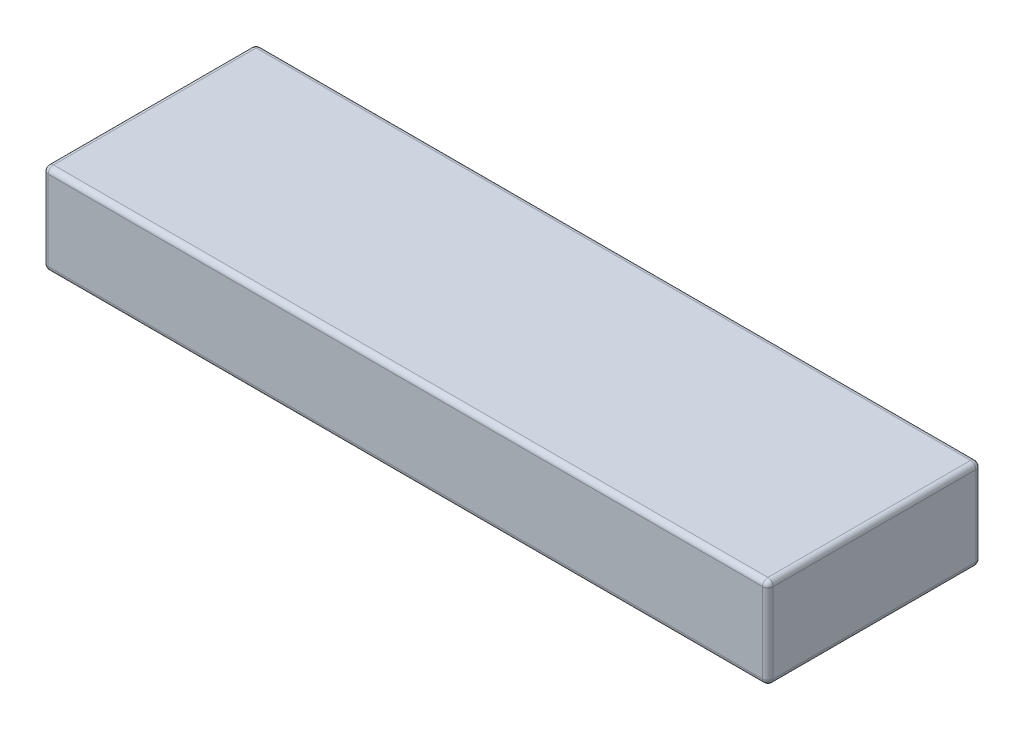
ISO-10303-21;
HEADER;
FILE_DESCRIPTION(('STEP AP214'),'2;1');
FILE_NAME('part.step','',(''),(''),'','','');
FILE_SCHEMA(('AUTOMOTIVE_DESIGN { 1 0 10303 214 1 1 1 1 }'));
ENDSEC;
DATA;
#1=APPLICATION_CONTEXT('core data for automotive mechanical design processes');
#2=APPLICATION_PROTOCOL_DEFINITION('international standard','automotive_design',2000,#1);
#3=PRODUCT_CONTEXT('',#1,'mechanical');
#4=PRODUCT('Part','Part','',(#3));
#5=PRODUCT_RELATED_PRODUCT_CATEGORY('part','',(#4));
#6=PRODUCT_DEFINITION_FORMATION('','',#4);
#7=PRODUCT_DEFINITION_CONTEXT('part definition',#1,'design');
#8=PRODUCT_DEFINITION('design','',#6,#7);
#9=PRODUCT_DEFINITION_SHAPE('','',#8);
#10=(LENGTH_UNIT() NAMED_UNIT(*) SI_UNIT(.MILLI.,.METRE.));
#11=(NAMED_UNIT(*) PLANE_ANGLE_UNIT() SI_UNIT($,.RADIAN.));
#12=(NAMED_UNIT(*) SI_UNIT($,.STERADIAN.) SOLID_ANGLE_UNIT());
#13=UNCERTAINTY_MEASURE_WITH_UNIT(LENGTH_MEASURE(1.E-05),#10,'distance_accuracy_value','');
#14=(GEOMETRIC_REPRESENTATION_CONTEXT(3) GLOBAL_UNCERTAINTY_ASSIGNED_CONTEXT((#13)) GLOBAL_UNIT_ASSIGNED_CONTEXT((#10,
#11,#12)) REPRESENTATION_CONTEXT('',''));
#15=CARTESIAN_POINT('',(0.,0.,0.));
#16=DIRECTION('',(0.,0.,1.));
#17=DIRECTION('',(1.,0.,0.));
#18=AXIS2_PLACEMENT_3D('',#15,#16,#17);
#19=CARTESIAN_POINT('',(68.,17.,20.));
#20=DIRECTION('',(-1.,0.,0.));
#21=DIRECTION('',(0.,0.,1.));
#22=AXIS2_PLACEMENT_3D('',#19,#20,#21);
#23=PLANE('',#22);
#24=DIRECTION('',(0.,0.,-1.));
#25=VECTOR('',#24,1.);
#26=CARTESIAN_POINT('',(68.,16.,20.));
#27=LINE('',#26,#25);
#28=CARTESIAN_POINT('',(68.,16.,-19.));
#29=VERTEX_POINT('',#28);
#30=CARTESIAN_POINT('',(68.,16.,19.));
#31=VERTEX_POINT('',#30);
#32=EDGE_CURVE('E223',#29,#31,#27,.F.);
#33=ORIENTED_EDGE('',*,*,#32,.T.);
#34=DIRECTION('',(0.,-1.,0.));
#35=VECTOR('',#34,1.);
#36=CARTESIAN_POINT('',(68.,17.,19.));
#37=LINE('',#36,#35);
#38=CARTESIAN_POINT('',(68.,1.,19.));
#39=VERTEX_POINT('',#38);
#40=EDGE_CURVE('E230',#31,#39,#37,.T.);
#41=ORIENTED_EDGE('',*,*,#40,.T.);
#42=DIRECTION('',(0.,0.,-1.));
#43=VECTOR('',#42,1.);
#44=CARTESIAN_POINT('',(68.,1.,-20.));
#45=LINE('',#44,#43);
#46=CARTESIAN_POINT('',(68.,1.,-19.));
#47=VERTEX_POINT('',#46);
#48=EDGE_CURVE('E226',#39,#47,#45,.T.);
#49=ORIENTED_EDGE('',*,*,#48,.T.);
#50=DIRECTION('',(0.,-1.,0.));
#51=VECTOR('',#50,1.);
#52=CARTESIAN_POINT('',(68.,17.,-19.));
#53=LINE('',#52,#51);
#54=EDGE_CURVE('E220',#47,#29,#53,.F.);
#55=ORIENTED_EDGE('',*,*,#54,.T.);
#56=EDGE_LOOP('',(#33,#41,#49,#55));
#57=FACE_BOUND('',#56,.T.);
#58=ADVANCED_FACE('F45',(#57),#23,.F.);
#59=CARTESIAN_POINT('',(-68.,17.,-20.));
#60=DIRECTION('',(0.,0.,1.));
#61=DIRECTION('',(1.,0.,0.));
#62=AXIS2_PLACEMENT_3D('',#59,#60,#61);
#63=PLANE('',#62);
#64=DIRECTION('',(-1.,0.,0.));
#65=VECTOR('',#64,1.);
#66=CARTESIAN_POINT('',(-68.,1.,-20.));
#67=LINE('',#66,#65);
#68=CARTESIAN_POINT('',(67.,1.,-20.));
#69=VERTEX_POINT('',#68);
#70=CARTESIAN_POINT('',(-67.,1.,-20.));
#71=VERTEX_POINT('',#70);
#72=EDGE_CURVE('E146',#69,#71,#67,.T.);
#73=ORIENTED_EDGE('',*,*,#72,.T.);
#74=DIRECTION('',(0.,-1.,0.));
#75=VECTOR('',#74,1.);
#76=CARTESIAN_POINT('',(-67.,17.,-20.));
#77=LINE('',#76,#75);
#78=CARTESIAN_POINT('',(-67.,16.,-20.));
#79=VERTEX_POINT('',#78);
#80=EDGE_CURVE('E141',#71,#79,#77,.F.);
#81=ORIENTED_EDGE('',*,*,#80,.T.);
#82=DIRECTION('',(-1.,0.,0.));
#83=VECTOR('',#82,1.);
#84=CARTESIAN_POINT('',(-68.,16.,-20.));
#85=LINE('',#84,#83);
#86=CARTESIAN_POINT('',(67.,16.,-20.));
#87=VERTEX_POINT('',#86);
#88=EDGE_CURVE('E133',#79,#87,#85,.F.);
#89=ORIENTED_EDGE('',*,*,#88,.T.);
#90=DIRECTION('',(0.,-1.,0.));
#91=VECTOR('',#90,1.);
#92=CARTESIAN_POINT('',(67.,17.,-20.));
#93=LINE('',#92,#91);
#94=EDGE_CURVE('E138',#87,#69,#93,.T.);
#95=ORIENTED_EDGE('',*,*,#94,.T.);
#96=EDGE_LOOP('',(#73,#81,#89,#95));
#97=FACE_BOUND('',#96,.T.);
#98=ADVANCED_FACE('F136',(#97),#63,.F.);
#99=CARTESIAN_POINT('',(-68.,17.,20.));
#100=DIRECTION('',(1.,0.,0.));
#101=DIRECTION('',(0.,0.,-1.));
#102=AXIS2_PLACEMENT_3D('',#99,#100,#101);
#103=PLANE('',#102);
#104=DIRECTION('',(0.,0.,1.));
#105=VECTOR('',#104,1.);
#106=CARTESIAN_POINT('',(-68.,16.,20.));
#107=LINE('',#106,#105);
#108=CARTESIAN_POINT('',(-68.,16.,19.));
#109=VERTEX_POINT('',#108);
#110=CARTESIAN_POINT('',(-68.,16.,-19.));
#111=VERTEX_POINT('',#110);
#112=EDGE_CURVE('E197',#109,#111,#107,.F.);
#113=ORIENTED_EDGE('',*,*,#112,.T.);
#114=DIRECTION('',(0.,-1.,0.));
#115=VECTOR('',#114,1.);
#116=CARTESIAN_POINT('',(-68.,17.,-19.));
#117=LINE('',#116,#115);
#118=CARTESIAN_POINT('',(-68.,1.,-19.));
#119=VERTEX_POINT('',#118);
#120=EDGE_CURVE('E204',#111,#119,#117,.T.);
#121=ORIENTED_EDGE('',*,*,#120,.T.);
#122=DIRECTION('',(0.,0.,1.));
#123=VECTOR('',#122,1.);
#124=CARTESIAN_POINT('',(-68.,1.,20.));
#125=LINE('',#124,#123);
#126=CARTESIAN_POINT('',(-68.,1.,19.));
#127=VERTEX_POINT('',#126);
#128=EDGE_CURVE('E200',#119,#127,#125,.T.);
#129=ORIENTED_EDGE('',*,*,#128,.T.);
#130=DIRECTION('',(0.,-1.,0.));
#131=VECTOR('',#130,1.);
#132=CARTESIAN_POINT('',(-68.,17.,19.));
#133=LINE('',#132,#131);
#134=EDGE_CURVE('E194',#127,#109,#133,.F.);
#135=ORIENTED_EDGE('',*,*,#134,.T.);
#136=EDGE_LOOP('',(#113,#121,#129,#135));
#137=FACE_BOUND('',#136,.T.);
#138=ADVANCED_FACE('F323',(#137),#103,.F.);
#139=CARTESIAN_POINT('',(-68.,17.,20.));
#140=DIRECTION('',(0.,0.,-1.));
#141=DIRECTION('',(-1.,0.,0.));
#142=AXIS2_PLACEMENT_3D('',#139,#140,#141);
#143=PLANE('',#142);
#144=DIRECTION('',(1.,0.,0.));
#145=VECTOR('',#144,1.);
#146=CARTESIAN_POINT('',(68.,1.,20.));
#147=LINE('',#146,#145);
#148=CARTESIAN_POINT('',(-67.,1.,20.));
#149=VERTEX_POINT('',#148);
#150=CARTESIAN_POINT('',(67.,1.,20.));
#151=VERTEX_POINT('',#150);
#152=EDGE_CURVE('E213',#149,#151,#147,.T.);
#153=ORIENTED_EDGE('',*,*,#152,.T.);
#154=DIRECTION('',(0.,-1.,0.));
#155=VECTOR('',#154,1.);
#156=CARTESIAN_POINT('',(67.,17.,20.));
#157=LINE('',#156,#155);
#158=CARTESIAN_POINT('',(67.,16.,20.));
#159=VERTEX_POINT('',#158);
#160=EDGE_CURVE('E217',#151,#159,#157,.F.);
#161=ORIENTED_EDGE('',*,*,#160,.T.);
#162=DIRECTION('',(1.,0.,0.));
#163=VECTOR('',#162,1.);
#164=CARTESIAN_POINT('',(-68.,16.,20.));
#165=LINE('',#164,#163);
#166=CARTESIAN_POINT('',(-67.,16.,20.));
#167=VERTEX_POINT('',#166);
#168=EDGE_CURVE('E210',#159,#167,#165,.F.);
#169=ORIENTED_EDGE('',*,*,#168,.T.);
#170=DIRECTION('',(0.,-1.,0.));
#171=VECTOR('',#170,1.);
#172=CARTESIAN_POINT('',(-67.,17.,20.));
#173=LINE('',#172,#171);
#174=EDGE_CURVE('E207',#167,#149,#173,.T.);
#175=ORIENTED_EDGE('',*,*,#174,.T.);
#176=EDGE_LOOP('',(#153,#161,#169,#175));
#177=FACE_BOUND('',#176,.T.);
#178=ADVANCED_FACE('F332',(#177),#143,.F.);
#179=CARTESIAN_POINT('',(0.,17.,0.));
#180=DIRECTION('',(0.,-1.,0.));
#181=DIRECTION('',(0.,0.,-1.));
#182=AXIS2_PLACEMENT_3D('',#179,#180,#181);
#183=PLANE('',#182);
#184=DIRECTION('',(0.,0.,1.));
#185=VECTOR('',#184,1.);
#186=CARTESIAN_POINT('',(-67.,17.,0.));
#187=LINE('',#186,#185);
#188=CARTESIAN_POINT('',(-67.,17.,-19.));
#189=VERTEX_POINT('',#188);
#190=CARTESIAN_POINT('',(-67.,17.,19.));
#191=VERTEX_POINT('',#190);
#192=EDGE_CURVE('E55',#189,#191,#187,.T.);
#193=ORIENTED_EDGE('',*,*,#192,.T.);
#194=DIRECTION('',(1.,0.,0.));
#195=VECTOR('',#194,1.);
#196=CARTESIAN_POINT('',(0.,17.,19.));
#197=LINE('',#196,#195);
#198=CARTESIAN_POINT('',(67.,17.,19.));
#199=VERTEX_POINT('',#198);
#200=EDGE_CURVE('E11',#191,#199,#197,.T.);
#201=ORIENTED_EDGE('',*,*,#200,.T.);
#202=DIRECTION('',(0.,0.,-1.));
#203=VECTOR('',#202,1.);
#204=CARTESIAN_POINT('',(67.,17.,0.));
#205=LINE('',#204,#203);
#206=CARTESIAN_POINT('',(67.,17.,-19.));
#207=VERTEX_POINT('',#206);
#208=EDGE_CURVE('E233',#199,#207,#205,.T.);
#209=ORIENTED_EDGE('',*,*,#208,.T.);
#210=DIRECTION('',(-1.,0.,0.));
#211=VECTOR('',#210,1.);
#212=CARTESIAN_POINT('',(0.,17.,-19.));
#213=LINE('',#212,#211);
#214=EDGE_CURVE('E66',#207,#189,#213,.T.);
#215=ORIENTED_EDGE('',*,*,#214,.T.);
#216=EDGE_LOOP('',(#193,#201,#209,#215));
#217=FACE_BOUND('',#216,.T.);
#218=ADVANCED_FACE('F354',(#217),#183,.F.);
#219=CARTESIAN_POINT('',(0.,0.,0.));
#220=DIRECTION('',(0.,-1.,0.));
#221=DIRECTION('',(0.,0.,-1.));
#222=AXIS2_PLACEMENT_3D('',#219,#220,#221);
#223=PLANE('',#222);
#224=DIRECTION('',(0.,0.,1.));
#225=VECTOR('',#224,1.);
#226=CARTESIAN_POINT('',(-67.,0.,-20.));
#227=LINE('',#226,#225);
#228=CARTESIAN_POINT('',(-67.,0.,19.));
#229=VERTEX_POINT('',#228);
#230=CARTESIAN_POINT('',(-67.,0.,-19.));
#231=VERTEX_POINT('',#230);
#232=EDGE_CURVE('E187',#229,#231,#227,.F.);
#233=ORIENTED_EDGE('',*,*,#232,.T.);
#234=DIRECTION('',(-1.,0.,0.));
#235=VECTOR('',#234,1.);
#236=CARTESIAN_POINT('',(68.,0.,-19.));
#237=LINE('',#236,#235);
#238=CARTESIAN_POINT('',(67.,0.,-19.));
#239=VERTEX_POINT('',#238);
#240=EDGE_CURVE('E190',#231,#239,#237,.F.);
#241=ORIENTED_EDGE('',*,*,#240,.T.);
#242=DIRECTION('',(0.,0.,-1.));
#243=VECTOR('',#242,1.);
#244=CARTESIAN_POINT('',(67.,0.,20.));
#245=LINE('',#244,#243);
#246=CARTESIAN_POINT('',(67.,0.,19.));
#247=VERTEX_POINT('',#246);
#248=EDGE_CURVE('E181',#239,#247,#245,.F.);
#249=ORIENTED_EDGE('',*,*,#248,.T.);
#250=DIRECTION('',(1.,0.,0.));
#251=VECTOR('',#250,1.);
#252=CARTESIAN_POINT('',(-68.,0.,19.));
#253=LINE('',#252,#251);
#254=EDGE_CURVE('E184',#247,#229,#253,.F.);
#255=ORIENTED_EDGE('',*,*,#254,.T.);
#256=EDGE_LOOP('',(#233,#241,#249,#255));
#257=FACE_BOUND('',#256,.T.);
#258=ADVANCED_FACE('F356',(#257),#223,.T.);
#259=CARTESIAN_POINT('',(0.,16.,19.));
#260=DIRECTION('',(1.,0.,0.));
#261=DIRECTION('',(0.,0.,-1.));
#262=AXIS2_PLACEMENT_3D('',#259,#260,#261);
#263=CYLINDRICAL_SURFACE('',#262,1.);
#264=CARTESIAN_POINT('',(67.,16.,19.));
#265=DIRECTION('',(1.,0.,0.));
#266=DIRECTION('',(0.,0.,-1.));
#267=AXIS2_PLACEMENT_3D('',#264,#265,#266);
#268=CIRCLE('',#267,1.);
#269=EDGE_CURVE('E49',#199,#159,#268,.T.);
#270=ORIENTED_EDGE('',*,*,#269,.F.);
#271=ORIENTED_EDGE('',*,*,#200,.F.);
#272=CARTESIAN_POINT('',(-67.,16.,19.));
#273=DIRECTION('',(-1.,0.,0.));
#274=DIRECTION('',(0.,0.,1.));
#275=AXIS2_PLACEMENT_3D('',#272,#273,#274);
#276=CIRCLE('',#275,1.);
#277=EDGE_CURVE('E175',#167,#191,#276,.T.);
#278=ORIENTED_EDGE('',*,*,#277,.F.);
#279=ORIENTED_EDGE('',*,*,#168,.F.);
#280=EDGE_LOOP('',(#270,#271,#278,#279));
#281=FACE_BOUND('',#280,.T.);
#282=ADVANCED_FACE('F47',(#281),#263,.T.);
#283=CARTESIAN_POINT('',(67.,16.,19.));
#284=DIRECTION('',(0.,0.,1.));
#285=DIRECTION('',(1.,0.,0.));
#286=AXIS2_PLACEMENT_3D('',#283,#284,#285);
#287=SPHERICAL_SURFACE('',#286,1.);
#288=CARTESIAN_POINT('',(67.,16.,19.));
#289=DIRECTION('',(0.,0.,1.));
#290=DIRECTION('',(1.,0.,0.));
#291=AXIS2_PLACEMENT_3D('',#288,#289,#290);
#292=CIRCLE('',#291,1.);
#293=EDGE_CURVE('E300',#199,#31,#292,.F.);
#294=ORIENTED_EDGE('',*,*,#293,.F.);
#295=ORIENTED_EDGE('',*,*,#269,.T.);
#296=CARTESIAN_POINT('',(67.,16.,19.));
#297=DIRECTION('',(0.,1.,0.));
#298=DIRECTION('',(0.,0.,1.));
#299=AXIS2_PLACEMENT_3D('',#296,#297,#298);
#300=CIRCLE('',#299,1.);
#301=EDGE_CURVE('E304',#31,#159,#300,.F.);
#302=ORIENTED_EDGE('',*,*,#301,.F.);
#303=EDGE_LOOP('',(#294,#295,#302));
#304=FACE_BOUND('',#303,.T.);
#305=ADVANCED_FACE('F350',(#304),#287,.T.);
#306=CARTESIAN_POINT('',(-67.,16.,19.));
#307=DIRECTION('',(0.,1.,0.));
#308=DIRECTION('',(0.,0.,1.));
#309=AXIS2_PLACEMENT_3D('',#306,#307,#308);
#310=SPHERICAL_SURFACE('',#309,1.);
#311=CARTESIAN_POINT('',(-67.,16.,19.));
#312=DIRECTION('',(0.,1.,0.));
#313=DIRECTION('',(0.,0.,1.));
#314=AXIS2_PLACEMENT_3D('',#311,#312,#313);
#315=CIRCLE('',#314,1.);
#316=EDGE_CURVE('E292',#167,#109,#315,.F.);
#317=ORIENTED_EDGE('',*,*,#316,.F.);
#318=ORIENTED_EDGE('',*,*,#277,.T.);
#319=CARTESIAN_POINT('',(-67.,16.,19.));
#320=DIRECTION('',(0.,0.,1.));
#321=DIRECTION('',(1.,0.,0.));
#322=AXIS2_PLACEMENT_3D('',#319,#320,#321);
#323=CIRCLE('',#322,1.);
#324=EDGE_CURVE('E296',#109,#191,#323,.F.);
#325=ORIENTED_EDGE('',*,*,#324,.F.);
#326=EDGE_LOOP('',(#317,#318,#325));
#327=FACE_BOUND('',#326,.T.);
#328=ADVANCED_FACE('F313',(#327),#310,.T.);
#329=CARTESIAN_POINT('',(67.,17.,19.));
#330=DIRECTION('',(0.,-1.,0.));
#331=DIRECTION('',(0.,0.,-1.));
#332=AXIS2_PLACEMENT_3D('',#329,#330,#331);
#333=CYLINDRICAL_SURFACE('',#332,1.);
#334=ORIENTED_EDGE('',*,*,#301,.T.);
#335=ORIENTED_EDGE('',*,*,#160,.F.);
#336=CARTESIAN_POINT('',(67.,1.,19.));
#337=DIRECTION('',(0.,-1.,0.));
#338=DIRECTION('',(0.,0.,-1.));
#339=AXIS2_PLACEMENT_3D('',#336,#337,#338);
#340=CIRCLE('',#339,1.);
#341=EDGE_CURVE('E285',#39,#151,#340,.T.);
#342=ORIENTED_EDGE('',*,*,#341,.F.);
#343=ORIENTED_EDGE('',*,*,#40,.F.);
#344=EDGE_LOOP('',(#334,#335,#342,#343));
#345=FACE_BOUND('',#344,.T.);
#346=ADVANCED_FACE('F344',(#345),#333,.T.);
#347=CARTESIAN_POINT('',(67.,16.,0.));
#348=DIRECTION('',(0.,0.,-1.));
#349=DIRECTION('',(-1.,0.,0.));
#350=AXIS2_PLACEMENT_3D('',#347,#348,#349);
#351=CYLINDRICAL_SURFACE('',#350,1.);
#352=ORIENTED_EDGE('',*,*,#293,.T.);
#353=ORIENTED_EDGE('',*,*,#32,.F.);
#354=CARTESIAN_POINT('',(67.,16.,-19.));
#355=DIRECTION('',(0.,0.,-1.));
#356=DIRECTION('',(-1.,0.,0.));
#357=AXIS2_PLACEMENT_3D('',#354,#355,#356);
#358=CIRCLE('',#357,1.);
#359=EDGE_CURVE('E156',#207,#29,#358,.T.);
#360=ORIENTED_EDGE('',*,*,#359,.F.);
#361=ORIENTED_EDGE('',*,*,#208,.F.);
#362=EDGE_LOOP('',(#352,#353,#360,#361));
#363=FACE_BOUND('',#362,.T.);
#364=ADVANCED_FACE('F353',(#363),#351,.T.);
#365=CARTESIAN_POINT('',(0.,16.,-19.));
#366=DIRECTION('',(-1.,0.,0.));
#367=DIRECTION('',(0.,0.,1.));
#368=AXIS2_PLACEMENT_3D('',#365,#366,#367);
#369=CYLINDRICAL_SURFACE('',#368,1.);
#370=CARTESIAN_POINT('',(-67.,16.,-19.));
#371=DIRECTION('',(-1.,0.,0.));
#372=DIRECTION('',(0.,0.,1.));
#373=AXIS2_PLACEMENT_3D('',#370,#371,#372);
#374=CIRCLE('',#373,1.);
#375=EDGE_CURVE('E157',#189,#79,#374,.T.);
#376=ORIENTED_EDGE('',*,*,#375,.F.);
#377=ORIENTED_EDGE('',*,*,#214,.F.);
#378=CARTESIAN_POINT('',(67.,16.,-19.));
#379=DIRECTION('',(1.,0.,0.));
#380=DIRECTION('',(0.,0.,-1.));
#381=AXIS2_PLACEMENT_3D('',#378,#379,#380);
#382=CIRCLE('',#381,1.);
#383=EDGE_CURVE('E149',#87,#207,#382,.T.);
#384=ORIENTED_EDGE('',*,*,#383,.F.);
#385=ORIENTED_EDGE('',*,*,#88,.F.);
#386=EDGE_LOOP('',(#376,#377,#384,#385));
#387=FACE_BOUND('',#386,.T.);
#388=ADVANCED_FACE('F151',(#387),#369,.T.);
#389=CARTESIAN_POINT('',(-67.,16.,0.));
#390=DIRECTION('',(0.,0.,1.));
#391=DIRECTION('',(1.,0.,0.));
#392=AXIS2_PLACEMENT_3D('',#389,#390,#391);
#393=CYLINDRICAL_SURFACE('',#392,1.);
#394=ORIENTED_EDGE('',*,*,#324,.T.);
#395=ORIENTED_EDGE('',*,*,#192,.F.);
#396=CARTESIAN_POINT('',(-67.,16.,-19.));
#397=DIRECTION('',(0.,0.,-1.));
#398=DIRECTION('',(-1.,0.,0.));
#399=AXIS2_PLACEMENT_3D('',#396,#397,#398);
#400=CIRCLE('',#399,1.);
#401=EDGE_CURVE('E277',#111,#189,#400,.T.);
#402=ORIENTED_EDGE('',*,*,#401,.F.);
#403=ORIENTED_EDGE('',*,*,#112,.F.);
#404=EDGE_LOOP('',(#394,#395,#402,#403));
#405=FACE_BOUND('',#404,.T.);
#406=ADVANCED_FACE('F319',(#405),#393,.T.);
#407=CARTESIAN_POINT('',(-67.,17.,19.));
#408=DIRECTION('',(0.,-1.,0.));
#409=DIRECTION('',(0.,0.,-1.));
#410=AXIS2_PLACEMENT_3D('',#407,#408,#409);
#411=CYLINDRICAL_SURFACE('',#410,1.);
#412=ORIENTED_EDGE('',*,*,#316,.T.);
#413=ORIENTED_EDGE('',*,*,#134,.F.);
#414=CARTESIAN_POINT('',(-67.,1.,19.));
#415=DIRECTION('',(0.,-1.,0.));
#416=DIRECTION('',(0.,0.,-1.));
#417=AXIS2_PLACEMENT_3D('',#414,#415,#416);
#418=CIRCLE('',#417,1.);
#419=EDGE_CURVE('E273',#149,#127,#418,.T.);
#420=ORIENTED_EDGE('',*,*,#419,.F.);
#421=ORIENTED_EDGE('',*,*,#174,.F.);
#422=EDGE_LOOP('',(#412,#413,#420,#421));
#423=FACE_BOUND('',#422,.T.);
#424=ADVANCED_FACE('F329',(#423),#411,.T.);
#425=CARTESIAN_POINT('',(-68.,1.,19.));
#426=DIRECTION('',(-1.,0.,0.));
#427=DIRECTION('',(0.,0.,1.));
#428=AXIS2_PLACEMENT_3D('',#425,#426,#427);
#429=CYLINDRICAL_SURFACE('',#428,1.);
#430=CARTESIAN_POINT('',(67.,1.,19.));
#431=DIRECTION('',(1.,0.,0.));
#432=DIRECTION('',(0.,0.,-1.));
#433=AXIS2_PLACEMENT_3D('',#430,#431,#432);
#434=CIRCLE('',#433,1.);
#435=EDGE_CURVE('E288',#151,#247,#434,.T.);
#436=ORIENTED_EDGE('',*,*,#435,.F.);
#437=ORIENTED_EDGE('',*,*,#152,.F.);
#438=CARTESIAN_POINT('',(-67.,1.,19.));
#439=DIRECTION('',(-1.,0.,0.));
#440=DIRECTION('',(0.,0.,1.));
#441=AXIS2_PLACEMENT_3D('',#438,#439,#440);
#442=CIRCLE('',#441,1.);
#443=EDGE_CURVE('E269',#229,#149,#442,.T.);
#444=ORIENTED_EDGE('',*,*,#443,.F.);
#445=ORIENTED_EDGE('',*,*,#254,.F.);
#446=EDGE_LOOP('',(#436,#437,#444,#445));
#447=FACE_BOUND('',#446,.T.);
#448=ADVANCED_FACE('F336',(#447),#429,.T.);
#449=CARTESIAN_POINT('',(67.,1.,19.));
#450=DIRECTION('',(0.,0.,1.));
#451=DIRECTION('',(0.,-1.,0.));
#452=AXIS2_PLACEMENT_3D('',#449,#450,#451);
#453=SPHERICAL_SURFACE('',#452,1.);
#454=ORIENTED_EDGE('',*,*,#341,.T.);
#455=ORIENTED_EDGE('',*,*,#435,.T.);
#456=CARTESIAN_POINT('',(67.,1.,19.));
#457=DIRECTION('',(0.,0.,1.));
#458=DIRECTION('',(1.,0.,0.));
#459=AXIS2_PLACEMENT_3D('',#456,#457,#458);
#460=CIRCLE('',#459,1.);
#461=EDGE_CURVE('E165',#39,#247,#460,.F.);
#462=ORIENTED_EDGE('',*,*,#461,.F.);
#463=EDGE_LOOP('',(#454,#455,#462));
#464=FACE_BOUND('',#463,.T.);
#465=ADVANCED_FACE('F410',(#464),#453,.T.);
#466=CARTESIAN_POINT('',(67.,16.,-19.));
#467=DIRECTION('',(0.,1.,0.));
#468=DIRECTION('',(0.,0.,1.));
#469=AXIS2_PLACEMENT_3D('',#466,#467,#468);
#470=SPHERICAL_SURFACE('',#469,1.);
#471=ORIENTED_EDGE('',*,*,#383,.T.);
#472=ORIENTED_EDGE('',*,*,#359,.T.);
#473=CARTESIAN_POINT('',(67.,16.,-19.));
#474=DIRECTION('',(0.,1.,0.));
#475=DIRECTION('',(0.,0.,1.));
#476=AXIS2_PLACEMENT_3D('',#473,#474,#475);
#477=CIRCLE('',#476,1.);
#478=EDGE_CURVE('E160',#87,#29,#477,.F.);
#479=ORIENTED_EDGE('',*,*,#478,.F.);
#480=EDGE_LOOP('',(#471,#472,#479));
#481=FACE_BOUND('',#480,.T.);
#482=ADVANCED_FACE('F161',(#481),#470,.T.);
#483=CARTESIAN_POINT('',(-67.,16.,-19.));
#484=DIRECTION('',(0.,1.,0.));
#485=DIRECTION('',(0.,0.,1.));
#486=AXIS2_PLACEMENT_3D('',#483,#484,#485);
#487=SPHERICAL_SURFACE('',#486,1.);
#488=ORIENTED_EDGE('',*,*,#401,.T.);
#489=ORIENTED_EDGE('',*,*,#375,.T.);
#490=CARTESIAN_POINT('',(-67.,16.,-19.));
#491=DIRECTION('',(0.,1.,0.));
#492=DIRECTION('',(0.,0.,1.));
#493=AXIS2_PLACEMENT_3D('',#490,#491,#492);
#494=CIRCLE('',#493,1.);
#495=EDGE_CURVE('E166',#111,#79,#494,.F.);
#496=ORIENTED_EDGE('',*,*,#495,.F.);
#497=EDGE_LOOP('',(#488,#489,#496));
#498=FACE_BOUND('',#497,.T.);
#499=ADVANCED_FACE('F403',(#498),#487,.T.);
#500=CARTESIAN_POINT('',(-67.,1.,19.));
#501=DIRECTION('',(0.,0.,1.));
#502=DIRECTION('',(0.,-1.,0.));
#503=AXIS2_PLACEMENT_3D('',#500,#501,#502);
#504=SPHERICAL_SURFACE('',#503,1.);
#505=ORIENTED_EDGE('',*,*,#443,.T.);
#506=ORIENTED_EDGE('',*,*,#419,.T.);
#507=CARTESIAN_POINT('',(-67.,1.,19.));
#508=DIRECTION('',(0.,0.,1.));
#509=DIRECTION('',(1.,0.,0.));
#510=AXIS2_PLACEMENT_3D('',#507,#508,#509);
#511=CIRCLE('',#510,1.);
#512=EDGE_CURVE('E260',#229,#127,#511,.F.);
#513=ORIENTED_EDGE('',*,*,#512,.F.);
#514=EDGE_LOOP('',(#505,#506,#513));
#515=FACE_BOUND('',#514,.T.);
#516=ADVANCED_FACE('F399',(#515),#504,.T.);
#517=CARTESIAN_POINT('',(67.,1.,20.));
#518=DIRECTION('',(0.,0.,1.));
#519=DIRECTION('',(1.,0.,0.));
#520=AXIS2_PLACEMENT_3D('',#517,#518,#519);
#521=CYLINDRICAL_SURFACE('',#520,1.);
#522=ORIENTED_EDGE('',*,*,#461,.T.);
#523=ORIENTED_EDGE('',*,*,#248,.F.);
#524=CARTESIAN_POINT('',(67.,1.,-19.));
#525=DIRECTION('',(0.,0.,-1.));
#526=DIRECTION('',(-1.,0.,0.));
#527=AXIS2_PLACEMENT_3D('',#524,#525,#526);
#528=CIRCLE('',#527,1.);
#529=EDGE_CURVE('E256',#47,#239,#528,.T.);
#530=ORIENTED_EDGE('',*,*,#529,.F.);
#531=ORIENTED_EDGE('',*,*,#48,.F.);
#532=EDGE_LOOP('',(#522,#523,#530,#531));
#533=FACE_BOUND('',#532,.T.);
#534=ADVANCED_FACE('F396',(#533),#521,.T.);
#535=CARTESIAN_POINT('',(67.,17.,-19.));
#536=DIRECTION('',(0.,-1.,0.));
#537=DIRECTION('',(0.,0.,-1.));
#538=AXIS2_PLACEMENT_3D('',#535,#536,#537);
#539=CYLINDRICAL_SURFACE('',#538,1.);
#540=ORIENTED_EDGE('',*,*,#478,.T.);
#541=ORIENTED_EDGE('',*,*,#54,.F.);
#542=CARTESIAN_POINT('',(67.,1.,-19.));
#543=DIRECTION('',(0.,-1.,0.));
#544=DIRECTION('',(0.,0.,-1.));
#545=AXIS2_PLACEMENT_3D('',#542,#543,#544);
#546=CIRCLE('',#545,1.);
#547=EDGE_CURVE('E169',#69,#47,#546,.T.);
#548=ORIENTED_EDGE('',*,*,#547,.F.);
#549=ORIENTED_EDGE('',*,*,#94,.F.);
#550=EDGE_LOOP('',(#540,#541,#548,#549));
#551=FACE_BOUND('',#550,.T.);
#552=ADVANCED_FACE('F168',(#551),#539,.T.);
#553=CARTESIAN_POINT('',(-67.,17.,-19.));
#554=DIRECTION('',(0.,-1.,0.));
#555=DIRECTION('',(0.,0.,-1.));
#556=AXIS2_PLACEMENT_3D('',#553,#554,#555);
#557=CYLINDRICAL_SURFACE('',#556,1.);
#558=ORIENTED_EDGE('',*,*,#495,.T.);
#559=ORIENTED_EDGE('',*,*,#80,.F.);
#560=CARTESIAN_POINT('',(-67.,1.,-19.));
#561=DIRECTION('',(0.,-1.,0.));
#562=DIRECTION('',(0.,0.,-1.));
#563=AXIS2_PLACEMENT_3D('',#560,#561,#562);
#564=CIRCLE('',#563,1.);
#565=EDGE_CURVE('E250',#119,#71,#564,.T.);
#566=ORIENTED_EDGE('',*,*,#565,.F.);
#567=ORIENTED_EDGE('',*,*,#120,.F.);
#568=EDGE_LOOP('',(#558,#559,#566,#567));
#569=FACE_BOUND('',#568,.T.);
#570=ADVANCED_FACE('F389',(#569),#557,.T.);
#571=CARTESIAN_POINT('',(-67.,1.,20.));
#572=DIRECTION('',(0.,0.,-1.));
#573=DIRECTION('',(-1.,0.,0.));
#574=AXIS2_PLACEMENT_3D('',#571,#572,#573);
#575=CYLINDRICAL_SURFACE('',#574,1.);
#576=ORIENTED_EDGE('',*,*,#512,.T.);
#577=ORIENTED_EDGE('',*,*,#128,.F.);
#578=CARTESIAN_POINT('',(-67.,1.,-19.));
#579=DIRECTION('',(0.,0.,-1.));
#580=DIRECTION('',(-1.,0.,0.));
#581=AXIS2_PLACEMENT_3D('',#578,#579,#580);
#582=CIRCLE('',#581,1.);
#583=EDGE_CURVE('E246',#231,#119,#582,.T.);
#584=ORIENTED_EDGE('',*,*,#583,.F.);
#585=ORIENTED_EDGE('',*,*,#232,.F.);
#586=EDGE_LOOP('',(#576,#577,#584,#585));
#587=FACE_BOUND('',#586,.T.);
#588=ADVANCED_FACE('F385',(#587),#575,.T.);
#589=CARTESIAN_POINT('',(67.,1.,-19.));
#590=DIRECTION('',(1.,0.,0.));
#591=DIRECTION('',(0.,1.,0.));
#592=AXIS2_PLACEMENT_3D('',#589,#590,#591);
#593=SPHERICAL_SURFACE('',#592,1.);
#594=ORIENTED_EDGE('',*,*,#547,.T.);
#595=ORIENTED_EDGE('',*,*,#529,.T.);
#596=CARTESIAN_POINT('',(67.,1.,-19.));
#597=DIRECTION('',(1.,0.,0.));
#598=DIRECTION('',(0.,0.,-1.));
#599=AXIS2_PLACEMENT_3D('',#596,#597,#598);
#600=CIRCLE('',#599,1.);
#601=EDGE_CURVE('E243',#69,#239,#600,.F.);
#602=ORIENTED_EDGE('',*,*,#601,.F.);
#603=EDGE_LOOP('',(#594,#595,#602));
#604=FACE_BOUND('',#603,.T.);
#605=ADVANCED_FACE('F381',(#604),#593,.T.);
#606=CARTESIAN_POINT('',(-67.,1.,-19.));
#607=DIRECTION('',(-1.,0.,0.));
#608=DIRECTION('',(0.,-1.,0.));
#609=AXIS2_PLACEMENT_3D('',#606,#607,#608);
#610=SPHERICAL_SURFACE('',#609,1.);
#611=ORIENTED_EDGE('',*,*,#583,.T.);
#612=ORIENTED_EDGE('',*,*,#565,.T.);
#613=CARTESIAN_POINT('',(-67.,1.,-19.));
#614=DIRECTION('',(-1.,0.,0.));
#615=DIRECTION('',(0.,0.,1.));
#616=AXIS2_PLACEMENT_3D('',#613,#614,#615);
#617=CIRCLE('',#616,1.);
#618=EDGE_CURVE('E240',#231,#71,#617,.F.);
#619=ORIENTED_EDGE('',*,*,#618,.F.);
#620=EDGE_LOOP('',(#611,#612,#619));
#621=FACE_BOUND('',#620,.T.);
#622=ADVANCED_FACE('F377',(#621),#610,.T.);
#623=CARTESIAN_POINT('',(-68.,1.,-19.));
#624=DIRECTION('',(1.,0.,0.));
#625=DIRECTION('',(0.,0.,-1.));
#626=AXIS2_PLACEMENT_3D('',#623,#624,#625);
#627=CYLINDRICAL_SURFACE('',#626,1.);
#628=ORIENTED_EDGE('',*,*,#601,.T.);
#629=ORIENTED_EDGE('',*,*,#240,.F.);
#630=ORIENTED_EDGE('',*,*,#618,.T.);
#631=ORIENTED_EDGE('',*,*,#72,.F.);
#632=EDGE_LOOP('',(#628,#629,#630,#631));
#633=FACE_BOUND('',#632,.T.);
#634=ADVANCED_FACE('F374',(#633),#627,.T.);
#635=CLOSED_SHELL('',(#58,#98,#138,#178,#218,#258,#282,#305,#328,#346,#364,#388,#406,#424,#448,
#465,#482,#499,#516,#534,#552,#570,#588,#605,#622,#634));
#636=MANIFOLD_SOLID_BREP('B2',#635);
#637=ADVANCED_BREP_SHAPE_REPRESENTATION('',(#18,#636),#14);
#638=SHAPE_DEFINITION_REPRESENTATION(#9,#637);
ENDSEC;
END-ISO-10303-21;
